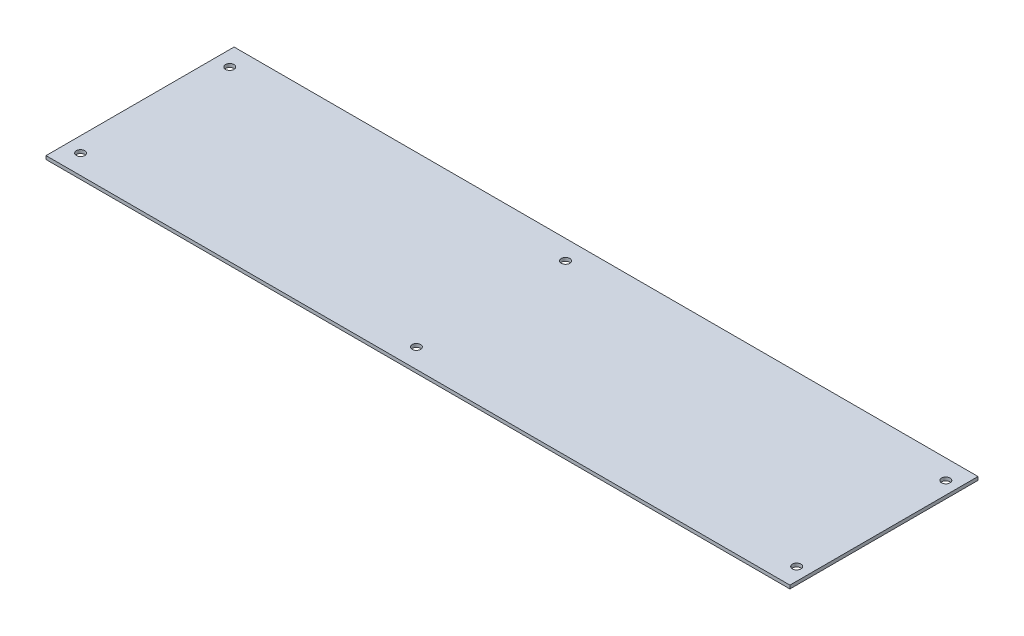
ISO-10303-21;
HEADER;
FILE_DESCRIPTION(('STEP AP214'),'2;1');
FILE_NAME('part.step','',(''),(''),'','','');
FILE_SCHEMA(('AUTOMOTIVE_DESIGN { 1 0 10303 214 1 1 1 1 }'));
ENDSEC;
DATA;
#1=APPLICATION_CONTEXT('core data for automotive mechanical design processes');
#2=APPLICATION_PROTOCOL_DEFINITION('international standard','automotive_design',2000,#1);
#3=PRODUCT_CONTEXT('',#1,'mechanical');
#4=PRODUCT('Part','Part','',(#3));
#5=PRODUCT_RELATED_PRODUCT_CATEGORY('part','',(#4));
#6=PRODUCT_DEFINITION_FORMATION('','',#4);
#7=PRODUCT_DEFINITION_CONTEXT('part definition',#1,'design');
#8=PRODUCT_DEFINITION('design','',#6,#7);
#9=PRODUCT_DEFINITION_SHAPE('','',#8);
#10=(LENGTH_UNIT() NAMED_UNIT(*) SI_UNIT(.MILLI.,.METRE.));
#11=(NAMED_UNIT(*) PLANE_ANGLE_UNIT() SI_UNIT($,.RADIAN.));
#12=(NAMED_UNIT(*) SI_UNIT($,.STERADIAN.) SOLID_ANGLE_UNIT());
#13=UNCERTAINTY_MEASURE_WITH_UNIT(LENGTH_MEASURE(1.E-05),#10,'distance_accuracy_value','');
#14=(GEOMETRIC_REPRESENTATION_CONTEXT(3) GLOBAL_UNCERTAINTY_ASSIGNED_CONTEXT((#13)) GLOBAL_UNIT_ASSIGNED_CONTEXT((#10,
#11,#12)) REPRESENTATION_CONTEXT('',''));
#15=CARTESIAN_POINT('',(0.,0.,0.));
#16=DIRECTION('',(0.,0.,1.));
#17=DIRECTION('',(1.,0.,0.));
#18=AXIS2_PLACEMENT_3D('',#15,#16,#17);
#19=CARTESIAN_POINT('',(0.,3.175,0.));
#20=DIRECTION('',(1.,0.,0.));
#21=DIRECTION('',(0.,0.,-1.));
#22=AXIS2_PLACEMENT_3D('',#19,#20,#21);
#23=PLANE('',#22);
#24=DIRECTION('',(0.,0.,1.));
#25=VECTOR('',#24,1.);
#26=CARTESIAN_POINT('',(0.,0.,0.));
#27=LINE('',#26,#25);
#28=CARTESIAN_POINT('',(0.,0.,0.));
#29=VERTEX_POINT('',#28);
#30=CARTESIAN_POINT('',(0.,0.,176.2125));
#31=VERTEX_POINT('',#30);
#32=EDGE_CURVE('E106',#29,#31,#27,.T.);
#33=ORIENTED_EDGE('',*,*,#32,.T.);
#34=DIRECTION('',(0.,-1.,0.));
#35=VECTOR('',#34,1.);
#36=CARTESIAN_POINT('',(0.,3.175,176.2125));
#37=LINE('',#36,#35);
#38=CARTESIAN_POINT('',(0.,3.175,176.2125));
#39=VERTEX_POINT('',#38);
#40=EDGE_CURVE('E11',#39,#31,#37,.T.);
#41=ORIENTED_EDGE('',*,*,#40,.F.);
#42=DIRECTION('',(0.,0.,1.));
#43=VECTOR('',#42,1.);
#44=CARTESIAN_POINT('',(0.,3.175,0.));
#45=LINE('',#44,#43);
#46=CARTESIAN_POINT('',(0.,3.175,0.));
#47=VERTEX_POINT('',#46);
#48=EDGE_CURVE('E94',#47,#39,#45,.T.);
#49=ORIENTED_EDGE('',*,*,#48,.F.);
#50=DIRECTION('',(0.,-1.,0.));
#51=VECTOR('',#50,1.);
#52=CARTESIAN_POINT('',(0.,3.175,0.));
#53=LINE('',#52,#51);
#54=EDGE_CURVE('E102',#47,#29,#53,.T.);
#55=ORIENTED_EDGE('',*,*,#54,.T.);
#56=EDGE_LOOP('',(#33,#41,#49,#55));
#57=FACE_BOUND('',#56,.T.);
#58=ADVANCED_FACE('F43',(#57),#23,.F.);
#59=CARTESIAN_POINT('',(0.,3.175,176.2125));
#60=DIRECTION('',(0.,0.,-1.));
#61=DIRECTION('',(-1.,0.,0.));
#62=AXIS2_PLACEMENT_3D('',#59,#60,#61);
#63=PLANE('',#62);
#64=DIRECTION('',(1.,0.,0.));
#65=VECTOR('',#64,1.);
#66=CARTESIAN_POINT('',(0.,0.,176.2125));
#67=LINE('',#66,#65);
#68=CARTESIAN_POINT('',(696.9125,0.,176.2125));
#69=VERTEX_POINT('',#68);
#70=EDGE_CURVE('E98',#31,#69,#67,.T.);
#71=ORIENTED_EDGE('',*,*,#70,.T.);
#72=DIRECTION('',(0.,-1.,0.));
#73=VECTOR('',#72,1.);
#74=CARTESIAN_POINT('',(696.9125,3.175,176.2125));
#75=LINE('',#74,#73);
#76=CARTESIAN_POINT('',(696.9125,3.175,176.2125));
#77=VERTEX_POINT('',#76);
#78=EDGE_CURVE('E51',#77,#69,#75,.T.);
#79=ORIENTED_EDGE('',*,*,#78,.F.);
#80=DIRECTION('',(1.,0.,0.));
#81=VECTOR('',#80,1.);
#82=CARTESIAN_POINT('',(0.,3.175,176.2125));
#83=LINE('',#82,#81);
#84=EDGE_CURVE('E89',#39,#77,#83,.T.);
#85=ORIENTED_EDGE('',*,*,#84,.F.);
#86=ORIENTED_EDGE('',*,*,#40,.T.);
#87=EDGE_LOOP('',(#71,#79,#85,#86));
#88=FACE_BOUND('',#87,.T.);
#89=ADVANCED_FACE('F97',(#88),#63,.F.);
#90=CARTESIAN_POINT('',(696.9125,3.175,0.));
#91=DIRECTION('',(-1.,0.,0.));
#92=DIRECTION('',(0.,0.,1.));
#93=AXIS2_PLACEMENT_3D('',#90,#91,#92);
#94=PLANE('',#93);
#95=DIRECTION('',(0.,0.,-1.));
#96=VECTOR('',#95,1.);
#97=CARTESIAN_POINT('',(696.9125,0.,0.));
#98=LINE('',#97,#96);
#99=CARTESIAN_POINT('',(696.9125,0.,0.));
#100=VERTEX_POINT('',#99);
#101=EDGE_CURVE('E76',#69,#100,#98,.T.);
#102=ORIENTED_EDGE('',*,*,#101,.T.);
#103=DIRECTION('',(0.,-1.,0.));
#104=VECTOR('',#103,1.);
#105=CARTESIAN_POINT('',(696.9125,3.175,0.));
#106=LINE('',#105,#104);
#107=CARTESIAN_POINT('',(696.9125,3.175,0.));
#108=VERTEX_POINT('',#107);
#109=EDGE_CURVE('E99',#108,#100,#106,.T.);
#110=ORIENTED_EDGE('',*,*,#109,.F.);
#111=DIRECTION('',(0.,0.,-1.));
#112=VECTOR('',#111,1.);
#113=CARTESIAN_POINT('',(696.9125,3.175,0.));
#114=LINE('',#113,#112);
#115=EDGE_CURVE('E92',#77,#108,#114,.T.);
#116=ORIENTED_EDGE('',*,*,#115,.F.);
#117=ORIENTED_EDGE('',*,*,#78,.T.);
#118=EDGE_LOOP('',(#102,#110,#116,#117));
#119=FACE_BOUND('',#118,.T.);
#120=ADVANCED_FACE('F100',(#119),#94,.F.);
#121=CARTESIAN_POINT('',(0.,3.175,0.));
#122=DIRECTION('',(0.,0.,1.));
#123=DIRECTION('',(1.,0.,0.));
#124=AXIS2_PLACEMENT_3D('',#121,#122,#123);
#125=PLANE('',#124);
#126=DIRECTION('',(-1.,0.,0.));
#127=VECTOR('',#126,1.);
#128=CARTESIAN_POINT('',(0.,0.,0.));
#129=LINE('',#128,#127);
#130=EDGE_CURVE('E82',#100,#29,#129,.T.);
#131=ORIENTED_EDGE('',*,*,#130,.T.);
#132=ORIENTED_EDGE('',*,*,#54,.F.);
#133=DIRECTION('',(-1.,0.,0.));
#134=VECTOR('',#133,1.);
#135=CARTESIAN_POINT('',(0.,3.175,0.));
#136=LINE('',#135,#134);
#137=EDGE_CURVE('E59',#108,#47,#136,.T.);
#138=ORIENTED_EDGE('',*,*,#137,.F.);
#139=ORIENTED_EDGE('',*,*,#109,.T.);
#140=EDGE_LOOP('',(#131,#132,#138,#139));
#141=FACE_BOUND('',#140,.T.);
#142=ADVANCED_FACE('F114',(#141),#125,.F.);
#143=CARTESIAN_POINT('',(0.,3.175,0.));
#144=DIRECTION('',(0.,1.,0.));
#145=DIRECTION('',(0.,0.,1.));
#146=AXIS2_PLACEMENT_3D('',#143,#144,#145);
#147=PLANE('',#146);
#148=CARTESIAN_POINT('',(328.749800214591,3.175,157.956250000028));
#149=DIRECTION('',(0.,1.,0.));
#150=DIRECTION('',(0.,0.,1.));
#151=AXIS2_PLACEMENT_3D('',#148,#149,#150);
#152=CIRCLE('',#151,3.96874999999999);
#153=CARTESIAN_POINT('',(328.749800214591,3.175,161.925000000028));
#154=VERTEX_POINT('',#153);
#155=EDGE_CURVE('E109',#154,#154,#152,.T.);
#156=ORIENTED_EDGE('',*,*,#155,.F.);
#157=EDGE_LOOP('',(#156));
#158=FACE_BOUND('',#157,.T.);
#159=CARTESIAN_POINT('',(685.00625,3.175,157.956250000017));
#160=DIRECTION('',(0.,1.,0.));
#161=DIRECTION('',(0.,0.,1.));
#162=AXIS2_PLACEMENT_3D('',#159,#160,#161);
#163=CIRCLE('',#162,3.96875);
#164=CARTESIAN_POINT('',(685.00625,3.175,161.925000000017));
#165=VERTEX_POINT('',#164);
#166=EDGE_CURVE('E122',#165,#165,#163,.T.);
#167=ORIENTED_EDGE('',*,*,#166,.F.);
#168=EDGE_LOOP('',(#167));
#169=FACE_BOUND('',#168,.T.);
#170=CARTESIAN_POINT('',(328.749800214591,3.175,18.2562500000055));
#171=DIRECTION('',(0.,1.,0.));
#172=DIRECTION('',(0.,0.,1.));
#173=AXIS2_PLACEMENT_3D('',#170,#171,#172);
#174=CIRCLE('',#173,3.96874999999999);
#175=CARTESIAN_POINT('',(328.749800214591,3.175,22.2250000000055));
#176=VERTEX_POINT('',#175);
#177=EDGE_CURVE('E125',#176,#176,#174,.T.);
#178=ORIENTED_EDGE('',*,*,#177,.F.);
#179=EDGE_LOOP('',(#178));
#180=FACE_BOUND('',#179,.T.);
#181=CARTESIAN_POINT('',(14.1693250849714,3.175,18.25625));
#182=DIRECTION('',(0.,1.,0.));
#183=DIRECTION('',(0.,0.,1.));
#184=AXIS2_PLACEMENT_3D('',#181,#182,#183);
#185=CIRCLE('',#184,3.96875000000005);
#186=CARTESIAN_POINT('',(14.1693250849714,3.175,22.225));
#187=VERTEX_POINT('',#186);
#188=EDGE_CURVE('E128',#187,#187,#185,.T.);
#189=ORIENTED_EDGE('',*,*,#188,.F.);
#190=EDGE_LOOP('',(#189));
#191=FACE_BOUND('',#190,.T.);
#192=CARTESIAN_POINT('',(14.1693250849714,3.175,157.956250000033));
#193=DIRECTION('',(0.,1.,0.));
#194=DIRECTION('',(0.,0.,1.));
#195=AXIS2_PLACEMENT_3D('',#192,#193,#194);
#196=CIRCLE('',#195,3.96875000000005);
#197=CARTESIAN_POINT('',(14.1693250849714,3.175,161.925000000033));
#198=VERTEX_POINT('',#197);
#199=EDGE_CURVE('E131',#198,#198,#196,.T.);
#200=ORIENTED_EDGE('',*,*,#199,.F.);
#201=EDGE_LOOP('',(#200));
#202=FACE_BOUND('',#201,.T.);
#203=CARTESIAN_POINT('',(685.00625,3.175,18.2562500000166));
#204=DIRECTION('',(0.,1.,0.));
#205=DIRECTION('',(0.,0.,1.));
#206=AXIS2_PLACEMENT_3D('',#203,#204,#205);
#207=CIRCLE('',#206,3.96874999999999);
#208=CARTESIAN_POINT('',(685.00625,3.175,22.2250000000166));
#209=VERTEX_POINT('',#208);
#210=EDGE_CURVE('E134',#209,#209,#207,.T.);
#211=ORIENTED_EDGE('',*,*,#210,.F.);
#212=EDGE_LOOP('',(#211));
#213=FACE_BOUND('',#212,.T.);
#214=ORIENTED_EDGE('',*,*,#48,.T.);
#215=ORIENTED_EDGE('',*,*,#84,.T.);
#216=ORIENTED_EDGE('',*,*,#115,.T.);
#217=ORIENTED_EDGE('',*,*,#137,.T.);
#218=EDGE_LOOP('',(#214,#215,#216,#217));
#219=FACE_BOUND('',#218,.T.);
#220=ADVANCED_FACE('F90',(#158,#169,#180,#191,#202,#213,#219),#147,.T.);
#221=CARTESIAN_POINT('',(0.,0.,0.));
#222=DIRECTION('',(0.,1.,0.));
#223=DIRECTION('',(0.,0.,1.));
#224=AXIS2_PLACEMENT_3D('',#221,#222,#223);
#225=PLANE('',#224);
#226=CARTESIAN_POINT('',(328.749800214591,0.,157.956250000028));
#227=DIRECTION('',(0.,1.,0.));
#228=DIRECTION('',(0.,0.,-1.));
#229=AXIS2_PLACEMENT_3D('',#226,#227,#228);
#230=CIRCLE('',#229,3.96874999999999);
#231=CARTESIAN_POINT('',(328.749800214591,0.,161.925000000028));
#232=VERTEX_POINT('',#231);
#233=EDGE_CURVE('E140',#232,#232,#230,.T.);
#234=ORIENTED_EDGE('',*,*,#233,.T.);
#235=EDGE_LOOP('',(#234));
#236=FACE_BOUND('',#235,.T.);
#237=CARTESIAN_POINT('',(685.00625,0.,157.956250000017));
#238=DIRECTION('',(0.,1.,0.));
#239=DIRECTION('',(0.,0.,-1.));
#240=AXIS2_PLACEMENT_3D('',#237,#238,#239);
#241=CIRCLE('',#240,3.96875);
#242=CARTESIAN_POINT('',(685.00625,0.,161.925000000017));
#243=VERTEX_POINT('',#242);
#244=EDGE_CURVE('E148',#243,#243,#241,.T.);
#245=ORIENTED_EDGE('',*,*,#244,.T.);
#246=EDGE_LOOP('',(#245));
#247=FACE_BOUND('',#246,.T.);
#248=CARTESIAN_POINT('',(328.749800214591,0.,18.2562500000055));
#249=DIRECTION('',(0.,1.,0.));
#250=DIRECTION('',(0.,0.,1.));
#251=AXIS2_PLACEMENT_3D('',#248,#249,#250);
#252=CIRCLE('',#251,3.96874999999999);
#253=CARTESIAN_POINT('',(328.749800214591,0.,22.2250000000055));
#254=VERTEX_POINT('',#253);
#255=EDGE_CURVE('E144',#254,#254,#252,.T.);
#256=ORIENTED_EDGE('',*,*,#255,.T.);
#257=EDGE_LOOP('',(#256));
#258=FACE_BOUND('',#257,.T.);
#259=CARTESIAN_POINT('',(14.1693250849714,0.,18.25625));
#260=DIRECTION('',(0.,1.,0.));
#261=DIRECTION('',(0.,0.,1.));
#262=AXIS2_PLACEMENT_3D('',#259,#260,#261);
#263=CIRCLE('',#262,3.96875000000005);
#264=CARTESIAN_POINT('',(14.1693250849714,0.,22.225));
#265=VERTEX_POINT('',#264);
#266=EDGE_CURVE('E141',#265,#265,#263,.T.);
#267=ORIENTED_EDGE('',*,*,#266,.T.);
#268=EDGE_LOOP('',(#267));
#269=FACE_BOUND('',#268,.T.);
#270=CARTESIAN_POINT('',(14.1693250849714,0.,157.956250000033));
#271=DIRECTION('',(0.,1.,0.));
#272=DIRECTION('',(0.,0.,-1.));
#273=AXIS2_PLACEMENT_3D('',#270,#271,#272);
#274=CIRCLE('',#273,3.96875000000005);
#275=CARTESIAN_POINT('',(14.1693250849714,0.,161.925000000033));
#276=VERTEX_POINT('',#275);
#277=EDGE_CURVE('E145',#276,#276,#274,.T.);
#278=ORIENTED_EDGE('',*,*,#277,.T.);
#279=EDGE_LOOP('',(#278));
#280=FACE_BOUND('',#279,.T.);
#281=CARTESIAN_POINT('',(685.00625,0.,18.2562500000166));
#282=DIRECTION('',(0.,1.,0.));
#283=DIRECTION('',(0.,0.,1.));
#284=AXIS2_PLACEMENT_3D('',#281,#282,#283);
#285=CIRCLE('',#284,3.96874999999999);
#286=CARTESIAN_POINT('',(685.00625,0.,22.2250000000166));
#287=VERTEX_POINT('',#286);
#288=EDGE_CURVE('E137',#287,#287,#285,.T.);
#289=ORIENTED_EDGE('',*,*,#288,.T.);
#290=EDGE_LOOP('',(#289));
#291=FACE_BOUND('',#290,.T.);
#292=ORIENTED_EDGE('',*,*,#32,.F.);
#293=ORIENTED_EDGE('',*,*,#130,.F.);
#294=ORIENTED_EDGE('',*,*,#101,.F.);
#295=ORIENTED_EDGE('',*,*,#70,.F.);
#296=EDGE_LOOP('',(#292,#293,#294,#295));
#297=FACE_BOUND('',#296,.T.);
#298=ADVANCED_FACE('F117',(#236,#247,#258,#269,#280,#291,#297),#225,.F.);
#299=CARTESIAN_POINT('',(685.00625,0.,18.2562500000166));
#300=DIRECTION('',(0.,1.,0.));
#301=DIRECTION('',(0.,0.,1.));
#302=AXIS2_PLACEMENT_3D('',#299,#300,#301);
#303=CYLINDRICAL_SURFACE('',#302,3.96874999999999);
#304=CARTESIAN_POINT('',(685.00625,3.175,22.2250000000166));
#305=CARTESIAN_POINT('',(685.00625,3.14192708333333,22.2250000000166));
#306=CARTESIAN_POINT('',(685.00625,3.10885416666667,22.2250000000166));
#307=CARTESIAN_POINT('',(685.00625,3.04270833333333,22.2250000000166));
#308=CARTESIAN_POINT('',(685.00625,3.00963541666667,22.2250000000166));
#309=CARTESIAN_POINT('',(685.00625,2.94348958333333,22.2250000000166));
#310=CARTESIAN_POINT('',(685.00625,2.91041666666667,22.2250000000166));
#311=CARTESIAN_POINT('',(685.00625,2.84427083333333,22.2250000000166));
#312=CARTESIAN_POINT('',(685.00625,2.81119791666667,22.2250000000166));
#313=CARTESIAN_POINT('',(685.00625,2.74505208333333,22.2250000000166));
#314=CARTESIAN_POINT('',(685.00625,2.71197916666667,22.2250000000166));
#315=CARTESIAN_POINT('',(685.00625,2.64583333333333,22.2250000000166));
#316=CARTESIAN_POINT('',(685.00625,2.61276041666667,22.2250000000166));
#317=CARTESIAN_POINT('',(685.00625,2.54661458333333,22.2250000000166));
#318=CARTESIAN_POINT('',(685.00625,2.51354166666667,22.2250000000166));
#319=CARTESIAN_POINT('',(685.00625,2.44739583333333,22.2250000000166));
#320=CARTESIAN_POINT('',(685.00625,2.41432291666667,22.2250000000166));
#321=CARTESIAN_POINT('',(685.00625,2.34817708333333,22.2250000000166));
#322=CARTESIAN_POINT('',(685.00625,2.31510416666667,22.2250000000166));
#323=CARTESIAN_POINT('',(685.00625,2.24895833333333,22.2250000000166));
#324=CARTESIAN_POINT('',(685.00625,2.21588541666667,22.2250000000166));
#325=CARTESIAN_POINT('',(685.00625,2.14973958333333,22.2250000000166));
#326=CARTESIAN_POINT('',(685.00625,2.11666666666667,22.2250000000166));
#327=CARTESIAN_POINT('',(685.00625,2.05052083333333,22.2250000000166));
#328=CARTESIAN_POINT('',(685.00625,2.01744791666667,22.2250000000166));
#329=CARTESIAN_POINT('',(685.00625,1.95130208333333,22.2250000000166));
#330=CARTESIAN_POINT('',(685.00625,1.91822916666667,22.2250000000166));
#331=CARTESIAN_POINT('',(685.00625,1.85208333333333,22.2250000000166));
#332=CARTESIAN_POINT('',(685.00625,1.81901041666667,22.2250000000166));
#333=CARTESIAN_POINT('',(685.00625,1.75286458333333,22.2250000000166));
#334=CARTESIAN_POINT('',(685.00625,1.71979166666667,22.2250000000166));
#335=CARTESIAN_POINT('',(685.00625,1.65364583333333,22.2250000000166));
#336=CARTESIAN_POINT('',(685.00625,1.62057291666667,22.2250000000166));
#337=CARTESIAN_POINT('',(685.00625,1.55442708333333,22.2250000000166));
#338=CARTESIAN_POINT('',(685.00625,1.52135416666667,22.2250000000166));
#339=CARTESIAN_POINT('',(685.00625,1.45520833333333,22.2250000000166));
#340=CARTESIAN_POINT('',(685.00625,1.42213541666667,22.2250000000166));
#341=CARTESIAN_POINT('',(685.00625,1.35598958333333,22.2250000000166));
#342=CARTESIAN_POINT('',(685.00625,1.32291666666667,22.2250000000166));
#343=CARTESIAN_POINT('',(685.00625,1.25677083333333,22.2250000000166));
#344=CARTESIAN_POINT('',(685.00625,1.22369791666667,22.2250000000166));
#345=CARTESIAN_POINT('',(685.00625,1.15755208333333,22.2250000000166));
#346=CARTESIAN_POINT('',(685.00625,1.12447916666667,22.2250000000166));
#347=CARTESIAN_POINT('',(685.00625,1.05833333333333,22.2250000000166));
#348=CARTESIAN_POINT('',(685.00625,1.02526041666667,22.2250000000166));
#349=CARTESIAN_POINT('',(685.00625,0.959114583333333,22.2250000000166));
#350=CARTESIAN_POINT('',(685.00625,0.926041666666667,22.2250000000166));
#351=CARTESIAN_POINT('',(685.00625,0.859895833333333,22.2250000000166));
#352=CARTESIAN_POINT('',(685.00625,0.826822916666667,22.2250000000166));
#353=CARTESIAN_POINT('',(685.00625,0.760677083333333,22.2250000000166));
#354=CARTESIAN_POINT('',(685.00625,0.727604166666666,22.2250000000166));
#355=CARTESIAN_POINT('',(685.00625,0.661458333333333,22.2250000000166));
#356=CARTESIAN_POINT('',(685.00625,0.628385416666666,22.2250000000166));
#357=CARTESIAN_POINT('',(685.00625,0.562239583333333,22.2250000000166));
#358=CARTESIAN_POINT('',(685.00625,0.529166666666666,22.2250000000166));
#359=CARTESIAN_POINT('',(685.00625,0.463020833333333,22.2250000000166));
#360=CARTESIAN_POINT('',(685.00625,0.429947916666667,22.2250000000166));
#361=CARTESIAN_POINT('',(685.00625,0.363802083333333,22.2250000000166));
#362=CARTESIAN_POINT('',(685.00625,0.330729166666667,22.2250000000166));
#363=CARTESIAN_POINT('',(685.00625,0.264583333333333,22.2250000000166));
#364=CARTESIAN_POINT('',(685.00625,0.231510416666667,22.2250000000166));
#365=CARTESIAN_POINT('',(685.00625,0.165364583333333,22.2250000000166));
#366=CARTESIAN_POINT('',(685.00625,0.132291666666667,22.2250000000166));
#367=CARTESIAN_POINT('',(685.00625,0.0661458333333333,22.2250000000166));
#368=CARTESIAN_POINT('',(685.00625,0.0330729166666666,22.2250000000166));
#369=CARTESIAN_POINT('',(685.00625,0.,22.2250000000166));
#370=B_SPLINE_CURVE_WITH_KNOTS('',3,(#304,#305,#306,#307,#308,#309,#310,#311,#312,#313,#314,
#315,#316,#317,#318,#319,#320,#321,#322,#323,#324,#325,#326,#327,#328,#329,#330,#331,#332,#333,
#334,#335,#336,#337,#338,#339,#340,#341,#342,#343,#344,#345,#346,#347,#348,#349,#350,#351,#352,
#353,#354,#355,#356,#357,#358,#359,#360,#361,#362,#363,#364,#365,#366,#367,#368,#369),
.UNSPECIFIED.,.F.,.F.,(4,2,2,2,2,2,2,2,2,2,2,2,2,2,2,2,2,2,2,2,2,2,2,2,2,2,2,2,2,2,2,2,4),(0.,
0.0992187499999999,0.1984375,0.29765625,0.396875,0.49609375,0.5953125,0.69453125,0.79375,
0.89296875,0.9921875,1.09140625,1.190625,1.28984375,1.3890625,1.48828125,1.5875,1.68671875,
1.7859375,1.88515625,1.984375,2.08359375,2.1828125,2.28203125,2.38125,2.48046875,2.5796875,
2.67890625,2.778125,2.87734375,2.9765625,3.07578125,3.175),.UNSPECIFIED.);
#371=EDGE_CURVE('BSEAM161',#209,#287,#370,.T.);
#372=ORIENTED_EDGE('',*,*,#210,.T.);
#373=ORIENTED_EDGE('',*,*,#288,.F.);
#374=ORIENTED_EDGE('',*,*,#371,.T.);
#375=ORIENTED_EDGE('',*,*,#371,.F.);
#376=EDGE_LOOP('',(#372,#374,#373,#375));
#377=FACE_BOUND('',#376,.T.);
#378=ADVANCED_FACE('F161',(#377),#303,.F.);
#379=CARTESIAN_POINT('',(14.1693250849714,0.,157.956250000033));
#380=DIRECTION('',(0.,1.,0.));
#381=DIRECTION('',(0.,0.,1.));
#382=AXIS2_PLACEMENT_3D('',#379,#380,#381);
#383=CYLINDRICAL_SURFACE('',#382,3.96875000000005);
#384=CARTESIAN_POINT('',(14.1693250849714,3.175,161.925000000033));
#385=CARTESIAN_POINT('',(14.1693250849714,3.14192708333333,161.925000000033));
#386=CARTESIAN_POINT('',(14.1693250849714,3.10885416666667,161.925000000033));
#387=CARTESIAN_POINT('',(14.1693250849714,3.04270833333333,161.925000000033));
#388=CARTESIAN_POINT('',(14.1693250849714,3.00963541666667,161.925000000033));
#389=CARTESIAN_POINT('',(14.1693250849714,2.94348958333333,161.925000000033));
#390=CARTESIAN_POINT('',(14.1693250849714,2.91041666666667,161.925000000033));
#391=CARTESIAN_POINT('',(14.1693250849714,2.84427083333333,161.925000000033));
#392=CARTESIAN_POINT('',(14.1693250849714,2.81119791666667,161.925000000033));
#393=CARTESIAN_POINT('',(14.1693250849714,2.74505208333333,161.925000000033));
#394=CARTESIAN_POINT('',(14.1693250849714,2.71197916666667,161.925000000033));
#395=CARTESIAN_POINT('',(14.1693250849714,2.64583333333333,161.925000000033));
#396=CARTESIAN_POINT('',(14.1693250849714,2.61276041666667,161.925000000033));
#397=CARTESIAN_POINT('',(14.1693250849714,2.54661458333333,161.925000000033));
#398=CARTESIAN_POINT('',(14.1693250849714,2.51354166666667,161.925000000033));
#399=CARTESIAN_POINT('',(14.1693250849714,2.44739583333333,161.925000000033));
#400=CARTESIAN_POINT('',(14.1693250849714,2.41432291666667,161.925000000033));
#401=CARTESIAN_POINT('',(14.1693250849714,2.34817708333333,161.925000000033));
#402=CARTESIAN_POINT('',(14.1693250849714,2.31510416666667,161.925000000033));
#403=CARTESIAN_POINT('',(14.1693250849714,2.24895833333333,161.925000000033));
#404=CARTESIAN_POINT('',(14.1693250849714,2.21588541666667,161.925000000033));
#405=CARTESIAN_POINT('',(14.1693250849714,2.14973958333333,161.925000000033));
#406=CARTESIAN_POINT('',(14.1693250849714,2.11666666666667,161.925000000033));
#407=CARTESIAN_POINT('',(14.1693250849714,2.05052083333333,161.925000000033));
#408=CARTESIAN_POINT('',(14.1693250849714,2.01744791666667,161.925000000033));
#409=CARTESIAN_POINT('',(14.1693250849714,1.95130208333333,161.925000000033));
#410=CARTESIAN_POINT('',(14.1693250849714,1.91822916666667,161.925000000033));
#411=CARTESIAN_POINT('',(14.1693250849714,1.85208333333333,161.925000000033));
#412=CARTESIAN_POINT('',(14.1693250849714,1.81901041666667,161.925000000033));
#413=CARTESIAN_POINT('',(14.1693250849714,1.75286458333333,161.925000000033));
#414=CARTESIAN_POINT('',(14.1693250849714,1.71979166666667,161.925000000033));
#415=CARTESIAN_POINT('',(14.1693250849714,1.65364583333333,161.925000000033));
#416=CARTESIAN_POINT('',(14.1693250849714,1.62057291666667,161.925000000033));
#417=CARTESIAN_POINT('',(14.1693250849714,1.55442708333333,161.925000000033));
#418=CARTESIAN_POINT('',(14.1693250849714,1.52135416666667,161.925000000033));
#419=CARTESIAN_POINT('',(14.1693250849714,1.45520833333333,161.925000000033));
#420=CARTESIAN_POINT('',(14.1693250849714,1.42213541666667,161.925000000033));
#421=CARTESIAN_POINT('',(14.1693250849714,1.35598958333333,161.925000000033));
#422=CARTESIAN_POINT('',(14.1693250849714,1.32291666666667,161.925000000033));
#423=CARTESIAN_POINT('',(14.1693250849714,1.25677083333333,161.925000000033));
#424=CARTESIAN_POINT('',(14.1693250849714,1.22369791666667,161.925000000033));
#425=CARTESIAN_POINT('',(14.1693250849714,1.15755208333333,161.925000000033));
#426=CARTESIAN_POINT('',(14.1693250849714,1.12447916666667,161.925000000033));
#427=CARTESIAN_POINT('',(14.1693250849714,1.05833333333333,161.925000000033));
#428=CARTESIAN_POINT('',(14.1693250849714,1.02526041666667,161.925000000033));
#429=CARTESIAN_POINT('',(14.1693250849714,0.959114583333333,161.925000000033));
#430=CARTESIAN_POINT('',(14.1693250849714,0.926041666666667,161.925000000033));
#431=CARTESIAN_POINT('',(14.1693250849714,0.859895833333333,161.925000000033));
#432=CARTESIAN_POINT('',(14.1693250849714,0.826822916666667,161.925000000033));
#433=CARTESIAN_POINT('',(14.1693250849714,0.760677083333333,161.925000000033));
#434=CARTESIAN_POINT('',(14.1693250849714,0.727604166666666,161.925000000033));
#435=CARTESIAN_POINT('',(14.1693250849714,0.661458333333333,161.925000000033));
#436=CARTESIAN_POINT('',(14.1693250849714,0.628385416666666,161.925000000033));
#437=CARTESIAN_POINT('',(14.1693250849714,0.562239583333333,161.925000000033));
#438=CARTESIAN_POINT('',(14.1693250849714,0.529166666666666,161.925000000033));
#439=CARTESIAN_POINT('',(14.1693250849714,0.463020833333333,161.925000000033));
#440=CARTESIAN_POINT('',(14.1693250849714,0.429947916666667,161.925000000033));
#441=CARTESIAN_POINT('',(14.1693250849714,0.363802083333333,161.925000000033));
#442=CARTESIAN_POINT('',(14.1693250849714,0.330729166666667,161.925000000033));
#443=CARTESIAN_POINT('',(14.1693250849714,0.264583333333333,161.925000000033));
#444=CARTESIAN_POINT('',(14.1693250849714,0.231510416666667,161.925000000033));
#445=CARTESIAN_POINT('',(14.1693250849714,0.165364583333333,161.925000000033));
#446=CARTESIAN_POINT('',(14.1693250849714,0.132291666666667,161.925000000033));
#447=CARTESIAN_POINT('',(14.1693250849714,0.0661458333333333,161.925000000033));
#448=CARTESIAN_POINT('',(14.1693250849714,0.0330729166666666,161.925000000033));
#449=CARTESIAN_POINT('',(14.1693250849714,0.,161.925000000033));
#450=B_SPLINE_CURVE_WITH_KNOTS('',3,(#384,#385,#386,#387,#388,#389,#390,#391,#392,#393,#394,
#395,#396,#397,#398,#399,#400,#401,#402,#403,#404,#405,#406,#407,#408,#409,#410,#411,#412,#413,
#414,#415,#416,#417,#418,#419,#420,#421,#422,#423,#424,#425,#426,#427,#428,#429,#430,#431,#432,
#433,#434,#435,#436,#437,#438,#439,#440,#441,#442,#443,#444,#445,#446,#447,#448,#449),
.UNSPECIFIED.,.F.,.F.,(4,2,2,2,2,2,2,2,2,2,2,2,2,2,2,2,2,2,2,2,2,2,2,2,2,2,2,2,2,2,2,2,4),(0.,
0.0992187499999999,0.1984375,0.29765625,0.396875,0.49609375,0.5953125,0.69453125,0.79375,
0.89296875,0.9921875,1.09140625,1.190625,1.28984375,1.3890625,1.48828125,1.5875,1.68671875,
1.7859375,1.88515625,1.984375,2.08359375,2.1828125,2.28203125,2.38125,2.48046875,2.5796875,
2.67890625,2.778125,2.87734375,2.9765625,3.07578125,3.175),.UNSPECIFIED.);
#451=EDGE_CURVE('BSEAM158',#198,#276,#450,.T.);
#452=ORIENTED_EDGE('',*,*,#199,.T.);
#453=ORIENTED_EDGE('',*,*,#277,.F.);
#454=ORIENTED_EDGE('',*,*,#451,.T.);
#455=ORIENTED_EDGE('',*,*,#451,.F.);
#456=EDGE_LOOP('',(#452,#454,#453,#455));
#457=FACE_BOUND('',#456,.T.);
#458=ADVANCED_FACE('F158',(#457),#383,.F.);
#459=CARTESIAN_POINT('',(14.1693250849714,0.,18.25625));
#460=DIRECTION('',(0.,1.,0.));
#461=DIRECTION('',(0.,0.,1.));
#462=AXIS2_PLACEMENT_3D('',#459,#460,#461);
#463=CYLINDRICAL_SURFACE('',#462,3.96875000000005);
#464=CARTESIAN_POINT('',(14.1693250849714,3.175,22.225));
#465=CARTESIAN_POINT('',(14.1693250849714,3.14192708333333,22.225));
#466=CARTESIAN_POINT('',(14.1693250849714,3.10885416666667,22.225));
#467=CARTESIAN_POINT('',(14.1693250849714,3.04270833333333,22.225));
#468=CARTESIAN_POINT('',(14.1693250849714,3.00963541666667,22.225));
#469=CARTESIAN_POINT('',(14.1693250849714,2.94348958333333,22.225));
#470=CARTESIAN_POINT('',(14.1693250849714,2.91041666666667,22.225));
#471=CARTESIAN_POINT('',(14.1693250849714,2.84427083333333,22.225));
#472=CARTESIAN_POINT('',(14.1693250849714,2.81119791666667,22.225));
#473=CARTESIAN_POINT('',(14.1693250849714,2.74505208333333,22.225));
#474=CARTESIAN_POINT('',(14.1693250849714,2.71197916666667,22.225));
#475=CARTESIAN_POINT('',(14.1693250849714,2.64583333333333,22.225));
#476=CARTESIAN_POINT('',(14.1693250849714,2.61276041666667,22.225));
#477=CARTESIAN_POINT('',(14.1693250849714,2.54661458333333,22.225));
#478=CARTESIAN_POINT('',(14.1693250849714,2.51354166666667,22.225));
#479=CARTESIAN_POINT('',(14.1693250849714,2.44739583333333,22.225));
#480=CARTESIAN_POINT('',(14.1693250849714,2.41432291666667,22.225));
#481=CARTESIAN_POINT('',(14.1693250849714,2.34817708333333,22.225));
#482=CARTESIAN_POINT('',(14.1693250849714,2.31510416666667,22.225));
#483=CARTESIAN_POINT('',(14.1693250849714,2.24895833333333,22.225));
#484=CARTESIAN_POINT('',(14.1693250849714,2.21588541666667,22.225));
#485=CARTESIAN_POINT('',(14.1693250849714,2.14973958333333,22.225));
#486=CARTESIAN_POINT('',(14.1693250849714,2.11666666666667,22.225));
#487=CARTESIAN_POINT('',(14.1693250849714,2.05052083333333,22.225));
#488=CARTESIAN_POINT('',(14.1693250849714,2.01744791666667,22.225));
#489=CARTESIAN_POINT('',(14.1693250849714,1.95130208333333,22.225));
#490=CARTESIAN_POINT('',(14.1693250849714,1.91822916666667,22.225));
#491=CARTESIAN_POINT('',(14.1693250849714,1.85208333333333,22.225));
#492=CARTESIAN_POINT('',(14.1693250849714,1.81901041666667,22.225));
#493=CARTESIAN_POINT('',(14.1693250849714,1.75286458333333,22.225));
#494=CARTESIAN_POINT('',(14.1693250849714,1.71979166666667,22.225));
#495=CARTESIAN_POINT('',(14.1693250849714,1.65364583333333,22.225));
#496=CARTESIAN_POINT('',(14.1693250849714,1.62057291666667,22.225));
#497=CARTESIAN_POINT('',(14.1693250849714,1.55442708333333,22.225));
#498=CARTESIAN_POINT('',(14.1693250849714,1.52135416666667,22.225));
#499=CARTESIAN_POINT('',(14.1693250849714,1.45520833333333,22.225));
#500=CARTESIAN_POINT('',(14.1693250849714,1.42213541666667,22.225));
#501=CARTESIAN_POINT('',(14.1693250849714,1.35598958333333,22.225));
#502=CARTESIAN_POINT('',(14.1693250849714,1.32291666666667,22.225));
#503=CARTESIAN_POINT('',(14.1693250849714,1.25677083333333,22.225));
#504=CARTESIAN_POINT('',(14.1693250849714,1.22369791666667,22.225));
#505=CARTESIAN_POINT('',(14.1693250849714,1.15755208333333,22.225));
#506=CARTESIAN_POINT('',(14.1693250849714,1.12447916666667,22.225));
#507=CARTESIAN_POINT('',(14.1693250849714,1.05833333333333,22.225));
#508=CARTESIAN_POINT('',(14.1693250849714,1.02526041666667,22.225));
#509=CARTESIAN_POINT('',(14.1693250849714,0.959114583333333,22.225));
#510=CARTESIAN_POINT('',(14.1693250849714,0.926041666666667,22.225));
#511=CARTESIAN_POINT('',(14.1693250849714,0.859895833333333,22.225));
#512=CARTESIAN_POINT('',(14.1693250849714,0.826822916666667,22.225));
#513=CARTESIAN_POINT('',(14.1693250849714,0.760677083333333,22.225));
#514=CARTESIAN_POINT('',(14.1693250849714,0.727604166666666,22.225));
#515=CARTESIAN_POINT('',(14.1693250849714,0.661458333333333,22.225));
#516=CARTESIAN_POINT('',(14.1693250849714,0.628385416666666,22.225));
#517=CARTESIAN_POINT('',(14.1693250849714,0.562239583333333,22.225));
#518=CARTESIAN_POINT('',(14.1693250849714,0.529166666666666,22.225));
#519=CARTESIAN_POINT('',(14.1693250849714,0.463020833333333,22.225));
#520=CARTESIAN_POINT('',(14.1693250849714,0.429947916666667,22.225));
#521=CARTESIAN_POINT('',(14.1693250849714,0.363802083333333,22.225));
#522=CARTESIAN_POINT('',(14.1693250849714,0.330729166666667,22.225));
#523=CARTESIAN_POINT('',(14.1693250849714,0.264583333333333,22.225));
#524=CARTESIAN_POINT('',(14.1693250849714,0.231510416666667,22.225));
#525=CARTESIAN_POINT('',(14.1693250849714,0.165364583333333,22.225));
#526=CARTESIAN_POINT('',(14.1693250849714,0.132291666666667,22.225));
#527=CARTESIAN_POINT('',(14.1693250849714,0.0661458333333333,22.225));
#528=CARTESIAN_POINT('',(14.1693250849714,0.0330729166666666,22.225));
#529=CARTESIAN_POINT('',(14.1693250849714,0.,22.225));
#530=B_SPLINE_CURVE_WITH_KNOTS('',3,(#464,#465,#466,#467,#468,#469,#470,#471,#472,#473,#474,
#475,#476,#477,#478,#479,#480,#481,#482,#483,#484,#485,#486,#487,#488,#489,#490,#491,#492,#493,
#494,#495,#496,#497,#498,#499,#500,#501,#502,#503,#504,#505,#506,#507,#508,#509,#510,#511,#512,
#513,#514,#515,#516,#517,#518,#519,#520,#521,#522,#523,#524,#525,#526,#527,#528,#529),
.UNSPECIFIED.,.F.,.F.,(4,2,2,2,2,2,2,2,2,2,2,2,2,2,2,2,2,2,2,2,2,2,2,2,2,2,2,2,2,2,2,2,4),(0.,
0.0992187499999999,0.1984375,0.29765625,0.396875,0.49609375,0.5953125,0.69453125,0.79375,
0.89296875,0.9921875,1.09140625,1.190625,1.28984375,1.3890625,1.48828125,1.5875,1.68671875,
1.7859375,1.88515625,1.984375,2.08359375,2.1828125,2.28203125,2.38125,2.48046875,2.5796875,
2.67890625,2.778125,2.87734375,2.9765625,3.07578125,3.175),.UNSPECIFIED.);
#531=EDGE_CURVE('BSEAM160',#187,#265,#530,.T.);
#532=ORIENTED_EDGE('',*,*,#188,.T.);
#533=ORIENTED_EDGE('',*,*,#266,.F.);
#534=ORIENTED_EDGE('',*,*,#531,.T.);
#535=ORIENTED_EDGE('',*,*,#531,.F.);
#536=EDGE_LOOP('',(#532,#534,#533,#535));
#537=FACE_BOUND('',#536,.T.);
#538=ADVANCED_FACE('F160',(#537),#463,.F.);
#539=CARTESIAN_POINT('',(328.749800214591,0.,18.2562500000055));
#540=DIRECTION('',(0.,1.,0.));
#541=DIRECTION('',(0.,0.,1.));
#542=AXIS2_PLACEMENT_3D('',#539,#540,#541);
#543=CYLINDRICAL_SURFACE('',#542,3.96874999999999);
#544=CARTESIAN_POINT('',(328.749800214591,3.175,22.2250000000055));
#545=CARTESIAN_POINT('',(328.749800214591,3.14192708333333,22.2250000000055));
#546=CARTESIAN_POINT('',(328.749800214591,3.10885416666667,22.2250000000055));
#547=CARTESIAN_POINT('',(328.749800214591,3.04270833333333,22.2250000000055));
#548=CARTESIAN_POINT('',(328.749800214591,3.00963541666667,22.2250000000055));
#549=CARTESIAN_POINT('',(328.749800214591,2.94348958333333,22.2250000000055));
#550=CARTESIAN_POINT('',(328.749800214591,2.91041666666667,22.2250000000055));
#551=CARTESIAN_POINT('',(328.749800214591,2.84427083333333,22.2250000000055));
#552=CARTESIAN_POINT('',(328.749800214591,2.81119791666667,22.2250000000055));
#553=CARTESIAN_POINT('',(328.749800214591,2.74505208333333,22.2250000000055));
#554=CARTESIAN_POINT('',(328.749800214591,2.71197916666667,22.2250000000055));
#555=CARTESIAN_POINT('',(328.749800214591,2.64583333333333,22.2250000000055));
#556=CARTESIAN_POINT('',(328.749800214591,2.61276041666667,22.2250000000055));
#557=CARTESIAN_POINT('',(328.749800214591,2.54661458333333,22.2250000000055));
#558=CARTESIAN_POINT('',(328.749800214591,2.51354166666667,22.2250000000055));
#559=CARTESIAN_POINT('',(328.749800214591,2.44739583333333,22.2250000000055));
#560=CARTESIAN_POINT('',(328.749800214591,2.41432291666667,22.2250000000055));
#561=CARTESIAN_POINT('',(328.749800214591,2.34817708333333,22.2250000000055));
#562=CARTESIAN_POINT('',(328.749800214591,2.31510416666667,22.2250000000055));
#563=CARTESIAN_POINT('',(328.749800214591,2.24895833333333,22.2250000000055));
#564=CARTESIAN_POINT('',(328.749800214591,2.21588541666667,22.2250000000055));
#565=CARTESIAN_POINT('',(328.749800214591,2.14973958333333,22.2250000000055));
#566=CARTESIAN_POINT('',(328.749800214591,2.11666666666667,22.2250000000055));
#567=CARTESIAN_POINT('',(328.749800214591,2.05052083333333,22.2250000000055));
#568=CARTESIAN_POINT('',(328.749800214591,2.01744791666667,22.2250000000055));
#569=CARTESIAN_POINT('',(328.749800214591,1.95130208333333,22.2250000000055));
#570=CARTESIAN_POINT('',(328.749800214591,1.91822916666667,22.2250000000055));
#571=CARTESIAN_POINT('',(328.749800214591,1.85208333333333,22.2250000000055));
#572=CARTESIAN_POINT('',(328.749800214591,1.81901041666667,22.2250000000055));
#573=CARTESIAN_POINT('',(328.749800214591,1.75286458333333,22.2250000000055));
#574=CARTESIAN_POINT('',(328.749800214591,1.71979166666667,22.2250000000055));
#575=CARTESIAN_POINT('',(328.749800214591,1.65364583333333,22.2250000000055));
#576=CARTESIAN_POINT('',(328.749800214591,1.62057291666667,22.2250000000055));
#577=CARTESIAN_POINT('',(328.749800214591,1.55442708333333,22.2250000000055));
#578=CARTESIAN_POINT('',(328.749800214591,1.52135416666667,22.2250000000055));
#579=CARTESIAN_POINT('',(328.749800214591,1.45520833333333,22.2250000000055));
#580=CARTESIAN_POINT('',(328.749800214591,1.42213541666667,22.2250000000055));
#581=CARTESIAN_POINT('',(328.749800214591,1.35598958333333,22.2250000000055));
#582=CARTESIAN_POINT('',(328.749800214591,1.32291666666667,22.2250000000055));
#583=CARTESIAN_POINT('',(328.749800214591,1.25677083333333,22.2250000000055));
#584=CARTESIAN_POINT('',(328.749800214591,1.22369791666667,22.2250000000055));
#585=CARTESIAN_POINT('',(328.749800214591,1.15755208333333,22.2250000000055));
#586=CARTESIAN_POINT('',(328.749800214591,1.12447916666667,22.2250000000055));
#587=CARTESIAN_POINT('',(328.749800214591,1.05833333333333,22.2250000000055));
#588=CARTESIAN_POINT('',(328.749800214591,1.02526041666667,22.2250000000055));
#589=CARTESIAN_POINT('',(328.749800214591,0.959114583333333,22.2250000000055));
#590=CARTESIAN_POINT('',(328.749800214591,0.926041666666667,22.2250000000055));
#591=CARTESIAN_POINT('',(328.749800214591,0.859895833333333,22.2250000000055));
#592=CARTESIAN_POINT('',(328.749800214591,0.826822916666667,22.2250000000055));
#593=CARTESIAN_POINT('',(328.749800214591,0.760677083333333,22.2250000000055));
#594=CARTESIAN_POINT('',(328.749800214591,0.727604166666666,22.2250000000055));
#595=CARTESIAN_POINT('',(328.749800214591,0.661458333333333,22.2250000000055));
#596=CARTESIAN_POINT('',(328.749800214591,0.628385416666666,22.2250000000055));
#597=CARTESIAN_POINT('',(328.749800214591,0.562239583333333,22.2250000000055));
#598=CARTESIAN_POINT('',(328.749800214591,0.529166666666666,22.2250000000055));
#599=CARTESIAN_POINT('',(328.749800214591,0.463020833333333,22.2250000000055));
#600=CARTESIAN_POINT('',(328.749800214591,0.429947916666667,22.2250000000055));
#601=CARTESIAN_POINT('',(328.749800214591,0.363802083333333,22.2250000000055));
#602=CARTESIAN_POINT('',(328.749800214591,0.330729166666667,22.2250000000055));
#603=CARTESIAN_POINT('',(328.749800214591,0.264583333333333,22.2250000000055));
#604=CARTESIAN_POINT('',(328.749800214591,0.231510416666667,22.2250000000055));
#605=CARTESIAN_POINT('',(328.749800214591,0.165364583333333,22.2250000000055));
#606=CARTESIAN_POINT('',(328.749800214591,0.132291666666667,22.2250000000055));
#607=CARTESIAN_POINT('',(328.749800214591,0.0661458333333333,22.2250000000055));
#608=CARTESIAN_POINT('',(328.749800214591,0.0330729166666666,22.2250000000055));
#609=CARTESIAN_POINT('',(328.749800214591,0.,22.2250000000055));
#610=B_SPLINE_CURVE_WITH_KNOTS('',3,(#544,#545,#546,#547,#548,#549,#550,#551,#552,#553,#554,
#555,#556,#557,#558,#559,#560,#561,#562,#563,#564,#565,#566,#567,#568,#569,#570,#571,#572,#573,
#574,#575,#576,#577,#578,#579,#580,#581,#582,#583,#584,#585,#586,#587,#588,#589,#590,#591,#592,
#593,#594,#595,#596,#597,#598,#599,#600,#601,#602,#603,#604,#605,#606,#607,#608,#609),
.UNSPECIFIED.,.F.,.F.,(4,2,2,2,2,2,2,2,2,2,2,2,2,2,2,2,2,2,2,2,2,2,2,2,2,2,2,2,2,2,2,2,4),(0.,
0.0992187499999999,0.1984375,0.29765625,0.396875,0.49609375,0.5953125,0.69453125,0.79375,
0.89296875,0.9921875,1.09140625,1.190625,1.28984375,1.3890625,1.48828125,1.5875,1.68671875,
1.7859375,1.88515625,1.984375,2.08359375,2.1828125,2.28203125,2.38125,2.48046875,2.5796875,
2.67890625,2.778125,2.87734375,2.9765625,3.07578125,3.175),.UNSPECIFIED.);
#611=EDGE_CURVE('BSEAM168',#176,#254,#610,.T.);
#612=ORIENTED_EDGE('',*,*,#177,.T.);
#613=ORIENTED_EDGE('',*,*,#255,.F.);
#614=ORIENTED_EDGE('',*,*,#611,.T.);
#615=ORIENTED_EDGE('',*,*,#611,.F.);
#616=EDGE_LOOP('',(#612,#614,#613,#615));
#617=FACE_BOUND('',#616,.T.);
#618=ADVANCED_FACE('F168',(#617),#543,.F.);
#619=CARTESIAN_POINT('',(685.00625,0.,157.956250000017));
#620=DIRECTION('',(0.,1.,0.));
#621=DIRECTION('',(0.,0.,1.));
#622=AXIS2_PLACEMENT_3D('',#619,#620,#621);
#623=CYLINDRICAL_SURFACE('',#622,3.96875);
#624=CARTESIAN_POINT('',(685.00625,3.175,161.925000000017));
#625=CARTESIAN_POINT('',(685.00625,3.14192708333333,161.925000000017));
#626=CARTESIAN_POINT('',(685.00625,3.10885416666667,161.925000000017));
#627=CARTESIAN_POINT('',(685.00625,3.04270833333333,161.925000000017));
#628=CARTESIAN_POINT('',(685.00625,3.00963541666667,161.925000000017));
#629=CARTESIAN_POINT('',(685.00625,2.94348958333333,161.925000000017));
#630=CARTESIAN_POINT('',(685.00625,2.91041666666667,161.925000000017));
#631=CARTESIAN_POINT('',(685.00625,2.84427083333333,161.925000000017));
#632=CARTESIAN_POINT('',(685.00625,2.81119791666667,161.925000000017));
#633=CARTESIAN_POINT('',(685.00625,2.74505208333333,161.925000000017));
#634=CARTESIAN_POINT('',(685.00625,2.71197916666667,161.925000000017));
#635=CARTESIAN_POINT('',(685.00625,2.64583333333333,161.925000000017));
#636=CARTESIAN_POINT('',(685.00625,2.61276041666667,161.925000000017));
#637=CARTESIAN_POINT('',(685.00625,2.54661458333333,161.925000000017));
#638=CARTESIAN_POINT('',(685.00625,2.51354166666667,161.925000000017));
#639=CARTESIAN_POINT('',(685.00625,2.44739583333333,161.925000000017));
#640=CARTESIAN_POINT('',(685.00625,2.41432291666667,161.925000000017));
#641=CARTESIAN_POINT('',(685.00625,2.34817708333333,161.925000000017));
#642=CARTESIAN_POINT('',(685.00625,2.31510416666667,161.925000000017));
#643=CARTESIAN_POINT('',(685.00625,2.24895833333333,161.925000000017));
#644=CARTESIAN_POINT('',(685.00625,2.21588541666667,161.925000000017));
#645=CARTESIAN_POINT('',(685.00625,2.14973958333333,161.925000000017));
#646=CARTESIAN_POINT('',(685.00625,2.11666666666667,161.925000000017));
#647=CARTESIAN_POINT('',(685.00625,2.05052083333333,161.925000000017));
#648=CARTESIAN_POINT('',(685.00625,2.01744791666667,161.925000000017));
#649=CARTESIAN_POINT('',(685.00625,1.95130208333333,161.925000000017));
#650=CARTESIAN_POINT('',(685.00625,1.91822916666667,161.925000000017));
#651=CARTESIAN_POINT('',(685.00625,1.85208333333333,161.925000000017));
#652=CARTESIAN_POINT('',(685.00625,1.81901041666667,161.925000000017));
#653=CARTESIAN_POINT('',(685.00625,1.75286458333333,161.925000000017));
#654=CARTESIAN_POINT('',(685.00625,1.71979166666667,161.925000000017));
#655=CARTESIAN_POINT('',(685.00625,1.65364583333333,161.925000000017));
#656=CARTESIAN_POINT('',(685.00625,1.62057291666667,161.925000000017));
#657=CARTESIAN_POINT('',(685.00625,1.55442708333333,161.925000000017));
#658=CARTESIAN_POINT('',(685.00625,1.52135416666667,161.925000000017));
#659=CARTESIAN_POINT('',(685.00625,1.45520833333333,161.925000000017));
#660=CARTESIAN_POINT('',(685.00625,1.42213541666667,161.925000000017));
#661=CARTESIAN_POINT('',(685.00625,1.35598958333333,161.925000000017));
#662=CARTESIAN_POINT('',(685.00625,1.32291666666667,161.925000000017));
#663=CARTESIAN_POINT('',(685.00625,1.25677083333333,161.925000000017));
#664=CARTESIAN_POINT('',(685.00625,1.22369791666667,161.925000000017));
#665=CARTESIAN_POINT('',(685.00625,1.15755208333333,161.925000000017));
#666=CARTESIAN_POINT('',(685.00625,1.12447916666667,161.925000000017));
#667=CARTESIAN_POINT('',(685.00625,1.05833333333333,161.925000000017));
#668=CARTESIAN_POINT('',(685.00625,1.02526041666667,161.925000000017));
#669=CARTESIAN_POINT('',(685.00625,0.959114583333333,161.925000000017));
#670=CARTESIAN_POINT('',(685.00625,0.926041666666667,161.925000000017));
#671=CARTESIAN_POINT('',(685.00625,0.859895833333333,161.925000000017));
#672=CARTESIAN_POINT('',(685.00625,0.826822916666667,161.925000000017));
#673=CARTESIAN_POINT('',(685.00625,0.760677083333333,161.925000000017));
#674=CARTESIAN_POINT('',(685.00625,0.727604166666666,161.925000000017));
#675=CARTESIAN_POINT('',(685.00625,0.661458333333333,161.925000000017));
#676=CARTESIAN_POINT('',(685.00625,0.628385416666666,161.925000000017));
#677=CARTESIAN_POINT('',(685.00625,0.562239583333333,161.925000000017));
#678=CARTESIAN_POINT('',(685.00625,0.529166666666666,161.925000000017));
#679=CARTESIAN_POINT('',(685.00625,0.463020833333333,161.925000000017));
#680=CARTESIAN_POINT('',(685.00625,0.429947916666667,161.925000000017));
#681=CARTESIAN_POINT('',(685.00625,0.363802083333333,161.925000000017));
#682=CARTESIAN_POINT('',(685.00625,0.330729166666667,161.925000000017));
#683=CARTESIAN_POINT('',(685.00625,0.264583333333333,161.925000000017));
#684=CARTESIAN_POINT('',(685.00625,0.231510416666667,161.925000000017));
#685=CARTESIAN_POINT('',(685.00625,0.165364583333333,161.925000000017));
#686=CARTESIAN_POINT('',(685.00625,0.132291666666667,161.925000000017));
#687=CARTESIAN_POINT('',(685.00625,0.0661458333333333,161.925000000017));
#688=CARTESIAN_POINT('',(685.00625,0.0330729166666666,161.925000000017));
#689=CARTESIAN_POINT('',(685.00625,0.,161.925000000017));
#690=B_SPLINE_CURVE_WITH_KNOTS('',3,(#624,#625,#626,#627,#628,#629,#630,#631,#632,#633,#634,
#635,#636,#637,#638,#639,#640,#641,#642,#643,#644,#645,#646,#647,#648,#649,#650,#651,#652,#653,
#654,#655,#656,#657,#658,#659,#660,#661,#662,#663,#664,#665,#666,#667,#668,#669,#670,#671,#672,
#673,#674,#675,#676,#677,#678,#679,#680,#681,#682,#683,#684,#685,#686,#687,#688,#689),
.UNSPECIFIED.,.F.,.F.,(4,2,2,2,2,2,2,2,2,2,2,2,2,2,2,2,2,2,2,2,2,2,2,2,2,2,2,2,2,2,2,2,4),(0.,
0.0992187499999999,0.1984375,0.29765625,0.396875,0.49609375,0.5953125,0.69453125,0.79375,
0.89296875,0.9921875,1.09140625,1.190625,1.28984375,1.3890625,1.48828125,1.5875,1.68671875,
1.7859375,1.88515625,1.984375,2.08359375,2.1828125,2.28203125,2.38125,2.48046875,2.5796875,
2.67890625,2.778125,2.87734375,2.9765625,3.07578125,3.175),.UNSPECIFIED.);
#691=EDGE_CURVE('BSEAM193',#165,#243,#690,.T.);
#692=ORIENTED_EDGE('',*,*,#166,.T.);
#693=ORIENTED_EDGE('',*,*,#244,.F.);
#694=ORIENTED_EDGE('',*,*,#691,.T.);
#695=ORIENTED_EDGE('',*,*,#691,.F.);
#696=EDGE_LOOP('',(#692,#694,#693,#695));
#697=FACE_BOUND('',#696,.T.);
#698=ADVANCED_FACE('F193',(#697),#623,.F.);
#699=CARTESIAN_POINT('',(328.749800214591,0.,157.956250000028));
#700=DIRECTION('',(0.,1.,0.));
#701=DIRECTION('',(0.,0.,1.));
#702=AXIS2_PLACEMENT_3D('',#699,#700,#701);
#703=CYLINDRICAL_SURFACE('',#702,3.96874999999999);
#704=CARTESIAN_POINT('',(328.749800214591,3.175,161.925000000028));
#705=CARTESIAN_POINT('',(328.749800214591,3.14192708333333,161.925000000028));
#706=CARTESIAN_POINT('',(328.749800214591,3.10885416666667,161.925000000028));
#707=CARTESIAN_POINT('',(328.749800214591,3.04270833333333,161.925000000028));
#708=CARTESIAN_POINT('',(328.749800214591,3.00963541666667,161.925000000028));
#709=CARTESIAN_POINT('',(328.749800214591,2.94348958333333,161.925000000028));
#710=CARTESIAN_POINT('',(328.749800214591,2.91041666666667,161.925000000028));
#711=CARTESIAN_POINT('',(328.749800214591,2.84427083333333,161.925000000028));
#712=CARTESIAN_POINT('',(328.749800214591,2.81119791666667,161.925000000028));
#713=CARTESIAN_POINT('',(328.749800214591,2.74505208333333,161.925000000028));
#714=CARTESIAN_POINT('',(328.749800214591,2.71197916666667,161.925000000028));
#715=CARTESIAN_POINT('',(328.749800214591,2.64583333333333,161.925000000028));
#716=CARTESIAN_POINT('',(328.749800214591,2.61276041666667,161.925000000028));
#717=CARTESIAN_POINT('',(328.749800214591,2.54661458333333,161.925000000028));
#718=CARTESIAN_POINT('',(328.749800214591,2.51354166666667,161.925000000028));
#719=CARTESIAN_POINT('',(328.749800214591,2.44739583333333,161.925000000028));
#720=CARTESIAN_POINT('',(328.749800214591,2.41432291666667,161.925000000028));
#721=CARTESIAN_POINT('',(328.749800214591,2.34817708333333,161.925000000028));
#722=CARTESIAN_POINT('',(328.749800214591,2.31510416666667,161.925000000028));
#723=CARTESIAN_POINT('',(328.749800214591,2.24895833333333,161.925000000028));
#724=CARTESIAN_POINT('',(328.749800214591,2.21588541666667,161.925000000028));
#725=CARTESIAN_POINT('',(328.749800214591,2.14973958333333,161.925000000028));
#726=CARTESIAN_POINT('',(328.749800214591,2.11666666666667,161.925000000028));
#727=CARTESIAN_POINT('',(328.749800214591,2.05052083333333,161.925000000028));
#728=CARTESIAN_POINT('',(328.749800214591,2.01744791666667,161.925000000028));
#729=CARTESIAN_POINT('',(328.749800214591,1.95130208333333,161.925000000028));
#730=CARTESIAN_POINT('',(328.749800214591,1.91822916666667,161.925000000028));
#731=CARTESIAN_POINT('',(328.749800214591,1.85208333333333,161.925000000028));
#732=CARTESIAN_POINT('',(328.749800214591,1.81901041666667,161.925000000028));
#733=CARTESIAN_POINT('',(328.749800214591,1.75286458333333,161.925000000028));
#734=CARTESIAN_POINT('',(328.749800214591,1.71979166666667,161.925000000028));
#735=CARTESIAN_POINT('',(328.749800214591,1.65364583333333,161.925000000028));
#736=CARTESIAN_POINT('',(328.749800214591,1.62057291666667,161.925000000028));
#737=CARTESIAN_POINT('',(328.749800214591,1.55442708333333,161.925000000028));
#738=CARTESIAN_POINT('',(328.749800214591,1.52135416666667,161.925000000028));
#739=CARTESIAN_POINT('',(328.749800214591,1.45520833333333,161.925000000028));
#740=CARTESIAN_POINT('',(328.749800214591,1.42213541666667,161.925000000028));
#741=CARTESIAN_POINT('',(328.749800214591,1.35598958333333,161.925000000028));
#742=CARTESIAN_POINT('',(328.749800214591,1.32291666666667,161.925000000028));
#743=CARTESIAN_POINT('',(328.749800214591,1.25677083333333,161.925000000028));
#744=CARTESIAN_POINT('',(328.749800214591,1.22369791666667,161.925000000028));
#745=CARTESIAN_POINT('',(328.749800214591,1.15755208333333,161.925000000028));
#746=CARTESIAN_POINT('',(328.749800214591,1.12447916666667,161.925000000028));
#747=CARTESIAN_POINT('',(328.749800214591,1.05833333333333,161.925000000028));
#748=CARTESIAN_POINT('',(328.749800214591,1.02526041666667,161.925000000028));
#749=CARTESIAN_POINT('',(328.749800214591,0.959114583333333,161.925000000028));
#750=CARTESIAN_POINT('',(328.749800214591,0.926041666666667,161.925000000028));
#751=CARTESIAN_POINT('',(328.749800214591,0.859895833333333,161.925000000028));
#752=CARTESIAN_POINT('',(328.749800214591,0.826822916666667,161.925000000028));
#753=CARTESIAN_POINT('',(328.749800214591,0.760677083333333,161.925000000028));
#754=CARTESIAN_POINT('',(328.749800214591,0.727604166666666,161.925000000028));
#755=CARTESIAN_POINT('',(328.749800214591,0.661458333333333,161.925000000028));
#756=CARTESIAN_POINT('',(328.749800214591,0.628385416666666,161.925000000028));
#757=CARTESIAN_POINT('',(328.749800214591,0.562239583333333,161.925000000028));
#758=CARTESIAN_POINT('',(328.749800214591,0.529166666666666,161.925000000028));
#759=CARTESIAN_POINT('',(328.749800214591,0.463020833333333,161.925000000028));
#760=CARTESIAN_POINT('',(328.749800214591,0.429947916666667,161.925000000028));
#761=CARTESIAN_POINT('',(328.749800214591,0.363802083333333,161.925000000028));
#762=CARTESIAN_POINT('',(328.749800214591,0.330729166666667,161.925000000028));
#763=CARTESIAN_POINT('',(328.749800214591,0.264583333333333,161.925000000028));
#764=CARTESIAN_POINT('',(328.749800214591,0.231510416666667,161.925000000028));
#765=CARTESIAN_POINT('',(328.749800214591,0.165364583333333,161.925000000028));
#766=CARTESIAN_POINT('',(328.749800214591,0.132291666666667,161.925000000028));
#767=CARTESIAN_POINT('',(328.749800214591,0.0661458333333333,161.925000000028));
#768=CARTESIAN_POINT('',(328.749800214591,0.0330729166666666,161.925000000028));
#769=CARTESIAN_POINT('',(328.749800214591,0.,161.925000000028));
#770=B_SPLINE_CURVE_WITH_KNOTS('',3,(#704,#705,#706,#707,#708,#709,#710,#711,#712,#713,#714,
#715,#716,#717,#718,#719,#720,#721,#722,#723,#724,#725,#726,#727,#728,#729,#730,#731,#732,#733,
#734,#735,#736,#737,#738,#739,#740,#741,#742,#743,#744,#745,#746,#747,#748,#749,#750,#751,#752,
#753,#754,#755,#756,#757,#758,#759,#760,#761,#762,#763,#764,#765,#766,#767,#768,#769),
.UNSPECIFIED.,.F.,.F.,(4,2,2,2,2,2,2,2,2,2,2,2,2,2,2,2,2,2,2,2,2,2,2,2,2,2,2,2,2,2,2,2,4),(0.,
0.0992187499999999,0.1984375,0.29765625,0.396875,0.49609375,0.5953125,0.69453125,0.79375,
0.89296875,0.9921875,1.09140625,1.190625,1.28984375,1.3890625,1.48828125,1.5875,1.68671875,
1.7859375,1.88515625,1.984375,2.08359375,2.1828125,2.28203125,2.38125,2.48046875,2.5796875,
2.67890625,2.778125,2.87734375,2.9765625,3.07578125,3.175),.UNSPECIFIED.);
#771=EDGE_CURVE('BSEAM196',#154,#232,#770,.T.);
#772=ORIENTED_EDGE('',*,*,#155,.T.);
#773=ORIENTED_EDGE('',*,*,#233,.F.);
#774=ORIENTED_EDGE('',*,*,#771,.T.);
#775=ORIENTED_EDGE('',*,*,#771,.F.);
#776=EDGE_LOOP('',(#772,#774,#773,#775));
#777=FACE_BOUND('',#776,.T.);
#778=ADVANCED_FACE('F196',(#777),#703,.F.);
#779=CLOSED_SHELL('',(#58,#89,#120,#142,#220,#298,#378,#458,#538,#618,#698,#778));
#780=MANIFOLD_SOLID_BREP('B2',#779);
#781=ADVANCED_BREP_SHAPE_REPRESENTATION('',(#18,#780),#14);
#782=SHAPE_DEFINITION_REPRESENTATION(#9,#781);
ENDSEC;
END-ISO-10303-21;
